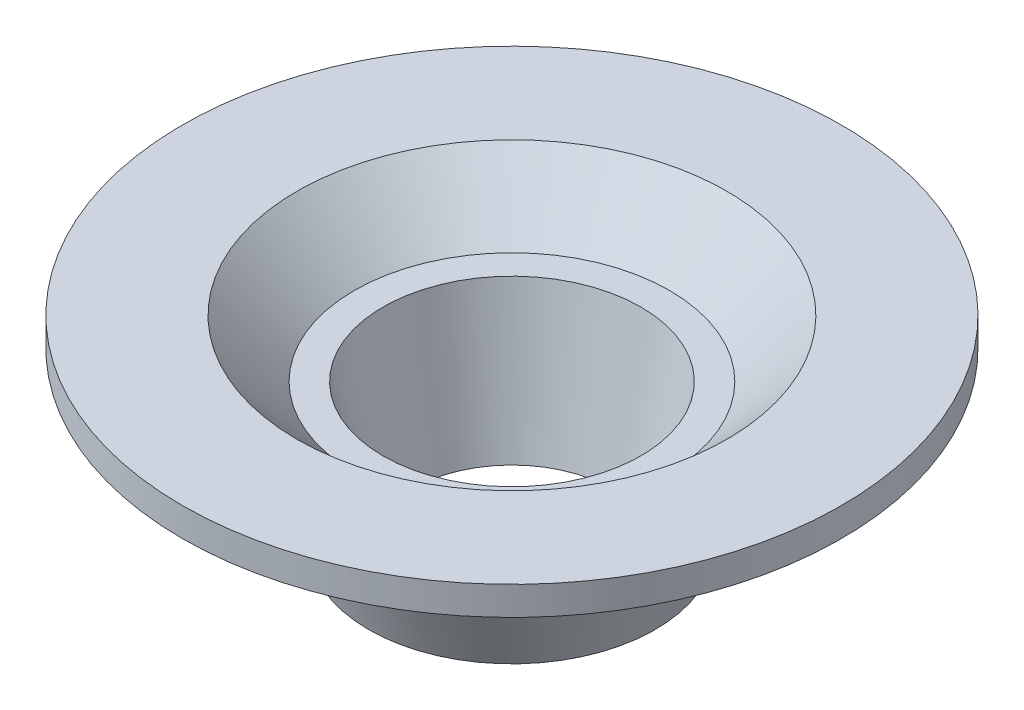
ISO-10303-21;
HEADER;
FILE_DESCRIPTION(('STEP AP214'),'2;1');
FILE_NAME('part.step','',(''),(''),'','','');
FILE_SCHEMA(('AUTOMOTIVE_DESIGN { 1 0 10303 214 1 1 1 1 }'));
ENDSEC;
DATA;
#1=APPLICATION_CONTEXT('core data for automotive mechanical design processes');
#2=APPLICATION_PROTOCOL_DEFINITION('international standard','automotive_design',2000,#1);
#3=PRODUCT_CONTEXT('',#1,'mechanical');
#4=PRODUCT('Part','Part','',(#3));
#5=PRODUCT_RELATED_PRODUCT_CATEGORY('part','',(#4));
#6=PRODUCT_DEFINITION_FORMATION('','',#4);
#7=PRODUCT_DEFINITION_CONTEXT('part definition',#1,'design');
#8=PRODUCT_DEFINITION('design','',#6,#7);
#9=PRODUCT_DEFINITION_SHAPE('','',#8);
#10=(LENGTH_UNIT() NAMED_UNIT(*) SI_UNIT(.MILLI.,.METRE.));
#11=(NAMED_UNIT(*) PLANE_ANGLE_UNIT() SI_UNIT($,.RADIAN.));
#12=(NAMED_UNIT(*) SI_UNIT($,.STERADIAN.) SOLID_ANGLE_UNIT());
#13=UNCERTAINTY_MEASURE_WITH_UNIT(LENGTH_MEASURE(1.E-05),#10,'distance_accuracy_value','');
#14=(GEOMETRIC_REPRESENTATION_CONTEXT(3) GLOBAL_UNCERTAINTY_ASSIGNED_CONTEXT((#13)) GLOBAL_UNIT_ASSIGNED_CONTEXT((#10,
#11,#12)) REPRESENTATION_CONTEXT('',''));
#15=CARTESIAN_POINT('',(0.,0.,0.));
#16=DIRECTION('',(0.,0.,1.));
#17=DIRECTION('',(1.,0.,0.));
#18=AXIS2_PLACEMENT_3D('',#15,#16,#17);
#19=CARTESIAN_POINT('',(0.,-5.,-5.));
#20=DIRECTION('',(0.,1.,0.));
#21=DIRECTION('',(0.,0.,1.));
#22=AXIS2_PLACEMENT_3D('',#19,#20,#21);
#23=PLANE('',#22);
#24=CARTESIAN_POINT('',(0.,-5.,0.));
#25=DIRECTION('',(0.,1.,0.));
#26=DIRECTION('',(0.,0.,1.));
#27=AXIS2_PLACEMENT_3D('',#24,#25,#26);
#28=CIRCLE('',#27,5.);
#29=CARTESIAN_POINT('',(0.,-5.,5.));
#30=VERTEX_POINT('',#29);
#31=EDGE_CURVE('E10',#30,#30,#28,.T.);
#32=ORIENTED_EDGE('',*,*,#31,.F.);
#33=EDGE_LOOP('',(#32));
#34=FACE_BOUND('',#33,.T.);
#35=CARTESIAN_POINT('',(0.,-5.,0.));
#36=DIRECTION('',(0.,1.,0.));
#37=DIRECTION('',(0.,0.,1.));
#38=AXIS2_PLACEMENT_3D('',#35,#36,#37);
#39=CIRCLE('',#38,3.5);
#40=CARTESIAN_POINT('',(0.,-5.,3.5));
#41=VERTEX_POINT('',#40);
#42=EDGE_CURVE('E65',#41,#41,#39,.T.);
#43=ORIENTED_EDGE('',*,*,#42,.T.);
#44=EDGE_LOOP('',(#43));
#45=FACE_BOUND('',#44,.T.);
#46=ADVANCED_FACE('F31',(#34,#45),#23,.F.);
#47=CARTESIAN_POINT('',(0.,-5.,0.));
#48=DIRECTION('',(0.,1.,0.));
#49=DIRECTION('',(0.,0.,1.));
#50=AXIS2_PLACEMENT_3D('',#47,#48,#49);
#51=CONICAL_SURFACE('',#50,5.,0.358770670270572);
#52=CARTESIAN_POINT('',(0.,-1.,0.));
#53=DIRECTION('',(0.,1.,0.));
#54=DIRECTION('',(0.,0.,1.));
#55=AXIS2_PLACEMENT_3D('',#52,#53,#54);
#56=CIRCLE('',#55,6.5);
#57=CARTESIAN_POINT('',(0.,-1.,6.5));
#58=VERTEX_POINT('',#57);
#59=EDGE_CURVE('E37',#58,#58,#56,.T.);
#60=ORIENTED_EDGE('',*,*,#59,.F.);
#61=EDGE_LOOP('',(#60));
#62=FACE_BOUND('',#61,.T.);
#63=ORIENTED_EDGE('',*,*,#31,.T.);
#64=EDGE_LOOP('',(#63));
#65=FACE_BOUND('',#64,.T.);
#66=ADVANCED_FACE('F114',(#62,#65),#51,.T.);
#67=CARTESIAN_POINT('',(0.,-1.,-7.5));
#68=DIRECTION('',(0.,1.,0.));
#69=DIRECTION('',(0.,0.,1.));
#70=AXIS2_PLACEMENT_3D('',#67,#68,#69);
#71=PLANE('',#70);
#72=CARTESIAN_POINT('',(0.,-1.,0.));
#73=DIRECTION('',(0.,1.,0.));
#74=DIRECTION('',(0.,0.,1.));
#75=AXIS2_PLACEMENT_3D('',#72,#73,#74);
#76=CIRCLE('',#75,7.5);
#77=CARTESIAN_POINT('',(0.,-1.,7.5));
#78=VERTEX_POINT('',#77);
#79=EDGE_CURVE('E41',#78,#78,#76,.T.);
#80=ORIENTED_EDGE('',*,*,#79,.F.);
#81=EDGE_LOOP('',(#80));
#82=FACE_BOUND('',#81,.T.);
#83=ORIENTED_EDGE('',*,*,#59,.T.);
#84=EDGE_LOOP('',(#83));
#85=FACE_BOUND('',#84,.T.);
#86=ADVANCED_FACE('F109',(#82,#85),#71,.F.);
#87=CARTESIAN_POINT('',(0.,-1.,0.));
#88=DIRECTION('',(0.,1.,0.));
#89=DIRECTION('',(0.,0.,1.));
#90=AXIS2_PLACEMENT_3D('',#87,#88,#89);
#91=CONICAL_SURFACE('',#90,7.5,0.785398163397448);
#92=CARTESIAN_POINT('',(0.,1.,0.));
#93=DIRECTION('',(0.,1.,0.));
#94=DIRECTION('',(0.,0.,1.));
#95=AXIS2_PLACEMENT_3D('',#92,#93,#94);
#96=CIRCLE('',#95,9.5);
#97=CARTESIAN_POINT('',(0.,1.,9.5));
#98=VERTEX_POINT('',#97);
#99=EDGE_CURVE('E45',#98,#98,#96,.T.);
#100=ORIENTED_EDGE('',*,*,#99,.F.);
#101=EDGE_LOOP('',(#100));
#102=FACE_BOUND('',#101,.T.);
#103=ORIENTED_EDGE('',*,*,#79,.T.);
#104=EDGE_LOOP('',(#103));
#105=FACE_BOUND('',#104,.T.);
#106=ADVANCED_FACE('F103',(#102,#105),#91,.T.);
#107=CARTESIAN_POINT('',(0.,1.,-11.5));
#108=DIRECTION('',(0.,1.,0.));
#109=DIRECTION('',(0.,0.,1.));
#110=AXIS2_PLACEMENT_3D('',#107,#108,#109);
#111=PLANE('',#110);
#112=CARTESIAN_POINT('',(0.,1.,0.));
#113=DIRECTION('',(0.,1.,0.));
#114=DIRECTION('',(0.,0.,1.));
#115=AXIS2_PLACEMENT_3D('',#112,#113,#114);
#116=CIRCLE('',#115,11.5);
#117=CARTESIAN_POINT('',(0.,1.,11.5));
#118=VERTEX_POINT('',#117);
#119=EDGE_CURVE('E50',#118,#118,#116,.T.);
#120=ORIENTED_EDGE('',*,*,#119,.F.);
#121=EDGE_LOOP('',(#120));
#122=FACE_BOUND('',#121,.T.);
#123=ORIENTED_EDGE('',*,*,#99,.T.);
#124=EDGE_LOOP('',(#123));
#125=FACE_BOUND('',#124,.T.);
#126=ADVANCED_FACE('F97',(#122,#125),#111,.F.);
#127=CARTESIAN_POINT('',(0.,0.,0.));
#128=DIRECTION('',(0.,1.,0.));
#129=DIRECTION('',(0.,0.,1.));
#130=AXIS2_PLACEMENT_3D('',#127,#128,#129);
#131=CYLINDRICAL_SURFACE('',#130,11.5);
#132=CARTESIAN_POINT('',(0.,2.,0.));
#133=DIRECTION('',(0.,1.,0.));
#134=DIRECTION('',(0.,0.,1.));
#135=AXIS2_PLACEMENT_3D('',#132,#133,#134);
#136=CIRCLE('',#135,11.5);
#137=CARTESIAN_POINT('',(0.,2.,11.5));
#138=VERTEX_POINT('',#137);
#139=EDGE_CURVE('E53',#138,#138,#136,.T.);
#140=ORIENTED_EDGE('',*,*,#139,.F.);
#141=EDGE_LOOP('',(#140));
#142=FACE_BOUND('',#141,.T.);
#143=ORIENTED_EDGE('',*,*,#119,.T.);
#144=EDGE_LOOP('',(#143));
#145=FACE_BOUND('',#144,.T.);
#146=ADVANCED_FACE('F91',(#142,#145),#131,.T.);
#147=CARTESIAN_POINT('',(0.,2.,-7.5));
#148=DIRECTION('',(0.,-1.,0.));
#149=DIRECTION('',(0.,0.,-1.));
#150=AXIS2_PLACEMENT_3D('',#147,#148,#149);
#151=PLANE('',#150);
#152=CARTESIAN_POINT('',(0.,2.,0.));
#153=DIRECTION('',(0.,1.,0.));
#154=DIRECTION('',(0.,0.,1.));
#155=AXIS2_PLACEMENT_3D('',#152,#153,#154);
#156=CIRCLE('',#155,7.5);
#157=CARTESIAN_POINT('',(0.,2.,7.5));
#158=VERTEX_POINT('',#157);
#159=EDGE_CURVE('E56',#158,#158,#156,.T.);
#160=ORIENTED_EDGE('',*,*,#159,.F.);
#161=EDGE_LOOP('',(#160));
#162=FACE_BOUND('',#161,.T.);
#163=ORIENTED_EDGE('',*,*,#139,.T.);
#164=EDGE_LOOP('',(#163));
#165=FACE_BOUND('',#164,.T.);
#166=ADVANCED_FACE('F85',(#162,#165),#151,.F.);
#167=CARTESIAN_POINT('',(0.,2.,0.));
#168=DIRECTION('',(0.,1.,0.));
#169=DIRECTION('',(0.,0.,1.));
#170=AXIS2_PLACEMENT_3D('',#167,#168,#169);
#171=CONICAL_SURFACE('',#170,7.5,0.785398163397448);
#172=CARTESIAN_POINT('',(0.,0.,0.));
#173=DIRECTION('',(0.,1.,0.));
#174=DIRECTION('',(0.,0.,1.));
#175=AXIS2_PLACEMENT_3D('',#172,#173,#174);
#176=CIRCLE('',#175,5.5);
#177=CARTESIAN_POINT('',(0.,0.,5.5));
#178=VERTEX_POINT('',#177);
#179=EDGE_CURVE('E59',#178,#178,#176,.T.);
#180=ORIENTED_EDGE('',*,*,#179,.F.);
#181=EDGE_LOOP('',(#180));
#182=FACE_BOUND('',#181,.T.);
#183=ORIENTED_EDGE('',*,*,#159,.T.);
#184=EDGE_LOOP('',(#183));
#185=FACE_BOUND('',#184,.T.);
#186=ADVANCED_FACE('F79',(#182,#185),#171,.F.);
#187=CARTESIAN_POINT('',(0.,0.,-4.5));
#188=DIRECTION('',(0.,-1.,0.));
#189=DIRECTION('',(0.,0.,-1.));
#190=AXIS2_PLACEMENT_3D('',#187,#188,#189);
#191=PLANE('',#190);
#192=CARTESIAN_POINT('',(0.,0.,0.));
#193=DIRECTION('',(0.,1.,0.));
#194=DIRECTION('',(0.,0.,1.));
#195=AXIS2_PLACEMENT_3D('',#192,#193,#194);
#196=CIRCLE('',#195,4.5);
#197=CARTESIAN_POINT('',(0.,0.,4.5));
#198=VERTEX_POINT('',#197);
#199=EDGE_CURVE('E62',#198,#198,#196,.T.);
#200=ORIENTED_EDGE('',*,*,#199,.F.);
#201=EDGE_LOOP('',(#200));
#202=FACE_BOUND('',#201,.T.);
#203=ORIENTED_EDGE('',*,*,#179,.T.);
#204=EDGE_LOOP('',(#203));
#205=FACE_BOUND('',#204,.T.);
#206=ADVANCED_FACE('F73',(#202,#205),#191,.F.);
#207=CARTESIAN_POINT('',(0.,0.,0.));
#208=DIRECTION('',(0.,1.,0.));
#209=DIRECTION('',(0.,0.,1.));
#210=AXIS2_PLACEMENT_3D('',#207,#208,#209);
#211=CONICAL_SURFACE('',#210,4.5,0.19739555984988);
#212=ORIENTED_EDGE('',*,*,#42,.F.);
#213=EDGE_LOOP('',(#212));
#214=FACE_BOUND('',#213,.T.);
#215=ORIENTED_EDGE('',*,*,#199,.T.);
#216=EDGE_LOOP('',(#215));
#217=FACE_BOUND('',#216,.T.);
#218=ADVANCED_FACE('F70',(#214,#217),#211,.F.);
#219=CLOSED_SHELL('',(#46,#66,#86,#106,#126,#146,#166,#186,#206,#218));
#220=MANIFOLD_SOLID_BREP('B2',#219);
#221=ADVANCED_BREP_SHAPE_REPRESENTATION('',(#18,#220),#14);
#222=SHAPE_DEFINITION_REPRESENTATION(#9,#221);
ENDSEC;
END-ISO-10303-21;
